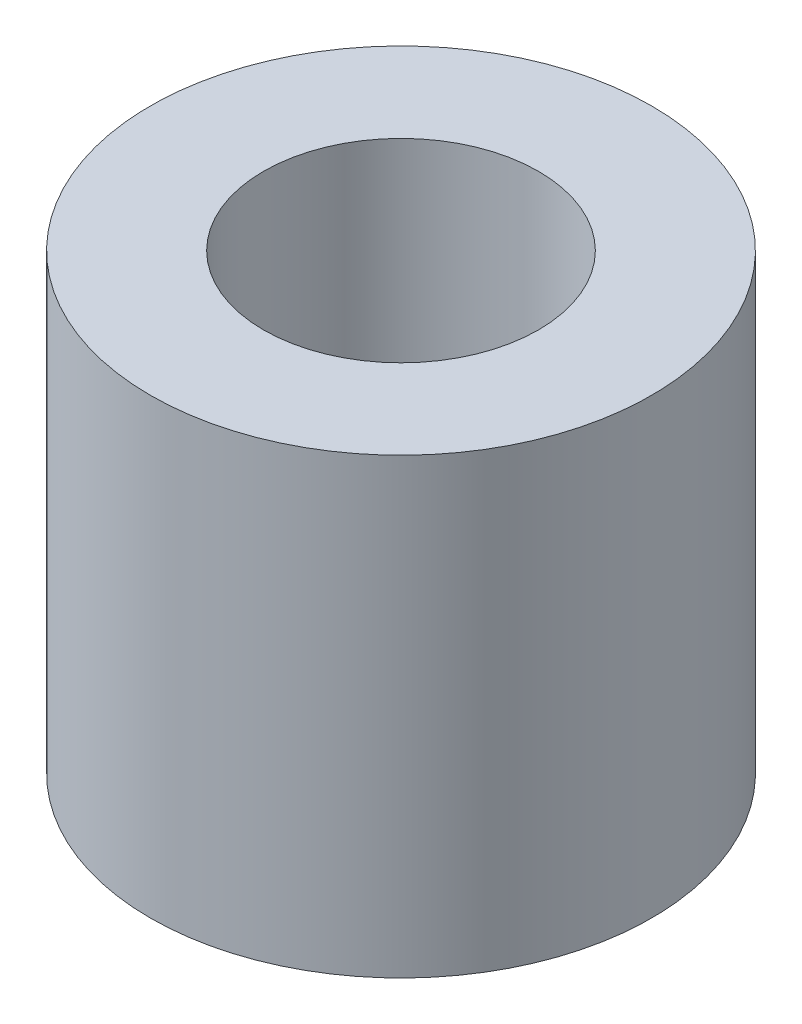
ISO-10303-21;
HEADER;
FILE_DESCRIPTION(('STEP AP214'),'2;1');
FILE_NAME('part.step','',(''),(''),'','','');
FILE_SCHEMA(('AUTOMOTIVE_DESIGN { 1 0 10303 214 1 1 1 1 }'));
ENDSEC;
DATA;
#1=APPLICATION_CONTEXT('core data for automotive mechanical design processes');
#2=APPLICATION_PROTOCOL_DEFINITION('international standard','automotive_design',2000,#1);
#3=PRODUCT_CONTEXT('',#1,'mechanical');
#4=PRODUCT('Part','Part','',(#3));
#5=PRODUCT_RELATED_PRODUCT_CATEGORY('part','',(#4));
#6=PRODUCT_DEFINITION_FORMATION('','',#4);
#7=PRODUCT_DEFINITION_CONTEXT('part definition',#1,'design');
#8=PRODUCT_DEFINITION('design','',#6,#7);
#9=PRODUCT_DEFINITION_SHAPE('','',#8);
#10=(LENGTH_UNIT() NAMED_UNIT(*) SI_UNIT(.MILLI.,.METRE.));
#11=(NAMED_UNIT(*) PLANE_ANGLE_UNIT() SI_UNIT($,.RADIAN.));
#12=(NAMED_UNIT(*) SI_UNIT($,.STERADIAN.) SOLID_ANGLE_UNIT());
#13=UNCERTAINTY_MEASURE_WITH_UNIT(LENGTH_MEASURE(1.E-05),#10,'distance_accuracy_value','');
#14=(GEOMETRIC_REPRESENTATION_CONTEXT(3) GLOBAL_UNCERTAINTY_ASSIGNED_CONTEXT((#13)) GLOBAL_UNIT_ASSIGNED_CONTEXT((#10,
#11,#12)) REPRESENTATION_CONTEXT('',''));
#15=CARTESIAN_POINT('',(0.,0.,0.));
#16=DIRECTION('',(0.,0.,1.));
#17=DIRECTION('',(1.,0.,0.));
#18=AXIS2_PLACEMENT_3D('',#15,#16,#17);
#19=CARTESIAN_POINT('',(0.,7.,0.));
#20=DIRECTION('',(0.,1.,0.));
#21=DIRECTION('',(0.,0.,1.));
#22=AXIS2_PLACEMENT_3D('',#19,#20,#21);
#23=PLANE('',#22);
#24=CARTESIAN_POINT('',(0.,7.,0.));
#25=DIRECTION('',(0.,1.,0.));
#26=DIRECTION('',(0.,0.,1.));
#27=AXIS2_PLACEMENT_3D('',#24,#25,#26);
#28=CIRCLE('',#27,3.875);
#29=CARTESIAN_POINT('',(0.,7.,3.875));
#30=VERTEX_POINT('',#29);
#31=EDGE_CURVE('E10',#30,#30,#28,.T.);
#32=ORIENTED_EDGE('',*,*,#31,.T.);
#33=EDGE_LOOP('',(#32));
#34=FACE_BOUND('',#33,.T.);
#35=CARTESIAN_POINT('',(0.,7.,0.));
#36=DIRECTION('',(0.,1.,0.));
#37=DIRECTION('',(0.,0.,1.));
#38=AXIS2_PLACEMENT_3D('',#35,#36,#37);
#39=CIRCLE('',#38,2.125);
#40=CARTESIAN_POINT('',(0.,7.,2.125));
#41=VERTEX_POINT('',#40);
#42=EDGE_CURVE('E45',#41,#41,#39,.T.);
#43=ORIENTED_EDGE('',*,*,#42,.F.);
#44=EDGE_LOOP('',(#43));
#45=FACE_BOUND('',#44,.T.);
#46=ADVANCED_FACE('F34',(#34,#45),#23,.T.);
#47=CARTESIAN_POINT('',(0.,0.,0.));
#48=DIRECTION('',(0.,1.,0.));
#49=DIRECTION('',(0.,0.,1.));
#50=AXIS2_PLACEMENT_3D('',#47,#48,#49);
#51=PLANE('',#50);
#52=CARTESIAN_POINT('',(0.,0.,0.));
#53=DIRECTION('',(0.,1.,0.));
#54=DIRECTION('',(0.,0.,1.));
#55=AXIS2_PLACEMENT_3D('',#52,#53,#54);
#56=CIRCLE('',#55,3.875);
#57=CARTESIAN_POINT('',(0.,0.,3.875));
#58=VERTEX_POINT('',#57);
#59=EDGE_CURVE('E38',#58,#58,#56,.T.);
#60=ORIENTED_EDGE('',*,*,#59,.F.);
#61=EDGE_LOOP('',(#60));
#62=FACE_BOUND('',#61,.T.);
#63=CARTESIAN_POINT('',(0.,0.,0.));
#64=DIRECTION('',(0.,1.,0.));
#65=DIRECTION('',(0.,0.,1.));
#66=AXIS2_PLACEMENT_3D('',#63,#64,#65);
#67=CIRCLE('',#66,2.125);
#68=CARTESIAN_POINT('',(0.,0.,2.125));
#69=VERTEX_POINT('',#68);
#70=EDGE_CURVE('E47',#69,#69,#67,.T.);
#71=ORIENTED_EDGE('',*,*,#70,.T.);
#72=EDGE_LOOP('',(#71));
#73=FACE_BOUND('',#72,.T.);
#74=ADVANCED_FACE('F57',(#62,#73),#51,.F.);
#75=CARTESIAN_POINT('',(0.,7.,0.));
#76=DIRECTION('',(0.,-1.,0.));
#77=DIRECTION('',(0.,0.,-1.));
#78=AXIS2_PLACEMENT_3D('',#75,#76,#77);
#79=CYLINDRICAL_SURFACE('',#78,3.875);
#80=ORIENTED_EDGE('',*,*,#31,.F.);
#81=EDGE_LOOP('',(#80));
#82=FACE_BOUND('',#81,.T.);
#83=ORIENTED_EDGE('',*,*,#59,.T.);
#84=EDGE_LOOP('',(#83));
#85=FACE_BOUND('',#84,.T.);
#86=ADVANCED_FACE('F36',(#82,#85),#79,.T.);
#87=CARTESIAN_POINT('',(0.,7.,0.));
#88=DIRECTION('',(0.,-1.,0.));
#89=DIRECTION('',(0.,0.,-1.));
#90=AXIS2_PLACEMENT_3D('',#87,#88,#89);
#91=CYLINDRICAL_SURFACE('',#90,2.125);
#92=ORIENTED_EDGE('',*,*,#42,.T.);
#93=EDGE_LOOP('',(#92));
#94=FACE_BOUND('',#93,.T.);
#95=ORIENTED_EDGE('',*,*,#70,.F.);
#96=EDGE_LOOP('',(#95));
#97=FACE_BOUND('',#96,.T.);
#98=ADVANCED_FACE('F53',(#94,#97),#91,.F.);
#99=CLOSED_SHELL('',(#46,#74,#86,#98));
#100=MANIFOLD_SOLID_BREP('B2',#99);
#101=ADVANCED_BREP_SHAPE_REPRESENTATION('',(#18,#100),#14);
#102=SHAPE_DEFINITION_REPRESENTATION(#9,#101);
ENDSEC;
END-ISO-10303-21;
